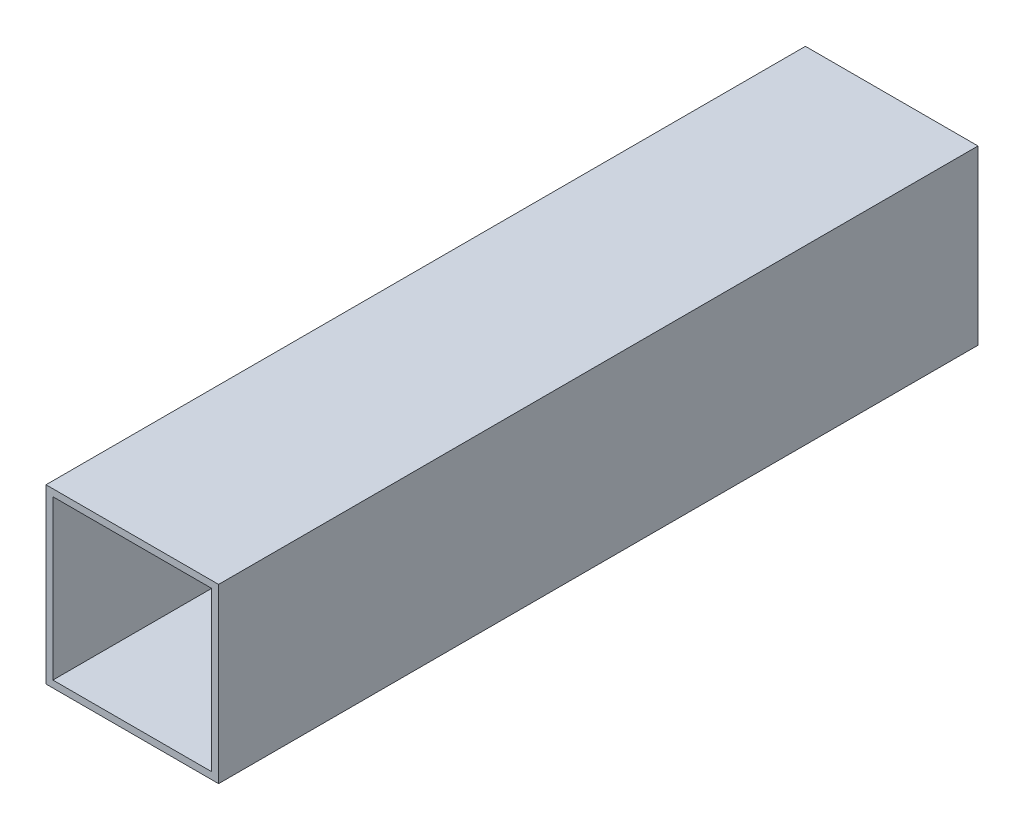
ISO-10303-21;
HEADER;
FILE_DESCRIPTION(('STEP AP214'),'2;1');
FILE_NAME('part.step','',(''),(''),'','','');
FILE_SCHEMA(('AUTOMOTIVE_DESIGN { 1 0 10303 214 1 1 1 1 }'));
ENDSEC;
DATA;
#1=APPLICATION_CONTEXT('core data for automotive mechanical design processes');
#2=APPLICATION_PROTOCOL_DEFINITION('international standard','automotive_design',2000,#1);
#3=PRODUCT_CONTEXT('',#1,'mechanical');
#4=PRODUCT('Part','Part','',(#3));
#5=PRODUCT_RELATED_PRODUCT_CATEGORY('part','',(#4));
#6=PRODUCT_DEFINITION_FORMATION('','',#4);
#7=PRODUCT_DEFINITION_CONTEXT('part definition',#1,'design');
#8=PRODUCT_DEFINITION('design','',#6,#7);
#9=PRODUCT_DEFINITION_SHAPE('','',#8);
#10=(LENGTH_UNIT() NAMED_UNIT(*) SI_UNIT(.MILLI.,.METRE.));
#11=(NAMED_UNIT(*) PLANE_ANGLE_UNIT() SI_UNIT($,.RADIAN.));
#12=(NAMED_UNIT(*) SI_UNIT($,.STERADIAN.) SOLID_ANGLE_UNIT());
#13=UNCERTAINTY_MEASURE_WITH_UNIT(LENGTH_MEASURE(1.E-05),#10,'distance_accuracy_value','');
#14=(GEOMETRIC_REPRESENTATION_CONTEXT(3) GLOBAL_UNCERTAINTY_ASSIGNED_CONTEXT((#13)) GLOBAL_UNIT_ASSIGNED_CONTEXT((#10,
#11,#12)) REPRESENTATION_CONTEXT('',''));
#15=CARTESIAN_POINT('',(0.,0.,0.));
#16=DIRECTION('',(0.,0.,1.));
#17=DIRECTION('',(1.,0.,0.));
#18=AXIS2_PLACEMENT_3D('',#15,#16,#17);
#19=CARTESIAN_POINT('',(0.,0.,220.));
#20=DIRECTION('',(0.,0.,-1.));
#21=DIRECTION('',(-1.,0.,0.));
#22=AXIS2_PLACEMENT_3D('',#19,#20,#21);
#23=PLANE('',#22);
#24=DIRECTION('',(0.,1.,0.));
#25=VECTOR('',#24,1.);
#26=CARTESIAN_POINT('',(25.,-25.,220.));
#27=LINE('',#26,#25);
#28=CARTESIAN_POINT('',(25.,-25.,220.));
#29=VERTEX_POINT('',#28);
#30=CARTESIAN_POINT('',(25.,25.,220.));
#31=VERTEX_POINT('',#30);
#32=EDGE_CURVE('E153',#29,#31,#27,.T.);
#33=ORIENTED_EDGE('',*,*,#32,.T.);
#34=DIRECTION('',(-1.,0.,0.));
#35=VECTOR('',#34,1.);
#36=CARTESIAN_POINT('',(-25.,25.,220.));
#37=LINE('',#36,#35);
#38=CARTESIAN_POINT('',(-25.,25.,220.));
#39=VERTEX_POINT('',#38);
#40=EDGE_CURVE('E157',#31,#39,#37,.T.);
#41=ORIENTED_EDGE('',*,*,#40,.T.);
#42=DIRECTION('',(0.,-1.,0.));
#43=VECTOR('',#42,1.);
#44=CARTESIAN_POINT('',(-25.,-25.,220.));
#45=LINE('',#44,#43);
#46=CARTESIAN_POINT('',(-25.,-25.,220.));
#47=VERTEX_POINT('',#46);
#48=EDGE_CURVE('E161',#39,#47,#45,.T.);
#49=ORIENTED_EDGE('',*,*,#48,.T.);
#50=DIRECTION('',(1.,0.,0.));
#51=VECTOR('',#50,1.);
#52=CARTESIAN_POINT('',(-25.,-25.,220.));
#53=LINE('',#52,#51);
#54=EDGE_CURVE('E164',#47,#29,#53,.T.);
#55=ORIENTED_EDGE('',*,*,#54,.T.);
#56=EDGE_LOOP('',(#33,#41,#49,#55));
#57=FACE_BOUND('',#56,.T.);
#58=DIRECTION('',(0.,1.,0.));
#59=VECTOR('',#58,1.);
#60=CARTESIAN_POINT('',(23.,-23.,220.));
#61=LINE('',#60,#59);
#62=CARTESIAN_POINT('',(23.,-23.,220.));
#63=VERTEX_POINT('',#62);
#64=CARTESIAN_POINT('',(23.,23.,220.));
#65=VERTEX_POINT('',#64);
#66=EDGE_CURVE('E105',#63,#65,#61,.T.);
#67=ORIENTED_EDGE('',*,*,#66,.F.);
#68=DIRECTION('',(1.,0.,0.));
#69=VECTOR('',#68,1.);
#70=CARTESIAN_POINT('',(-23.,-23.,220.));
#71=LINE('',#70,#69);
#72=CARTESIAN_POINT('',(-23.,-23.,220.));
#73=VERTEX_POINT('',#72);
#74=EDGE_CURVE('E131',#73,#63,#71,.T.);
#75=ORIENTED_EDGE('',*,*,#74,.F.);
#76=DIRECTION('',(0.,-1.,0.));
#77=VECTOR('',#76,1.);
#78=CARTESIAN_POINT('',(-23.,-23.,220.));
#79=LINE('',#78,#77);
#80=CARTESIAN_POINT('',(-23.,23.,220.));
#81=VERTEX_POINT('',#80);
#82=EDGE_CURVE('E127',#81,#73,#79,.T.);
#83=ORIENTED_EDGE('',*,*,#82,.F.);
#84=DIRECTION('',(-1.,0.,0.));
#85=VECTOR('',#84,1.);
#86=CARTESIAN_POINT('',(-23.,23.,220.));
#87=LINE('',#86,#85);
#88=EDGE_CURVE('E114',#65,#81,#87,.T.);
#89=ORIENTED_EDGE('',*,*,#88,.F.);
#90=EDGE_LOOP('',(#67,#75,#83,#89));
#91=FACE_BOUND('',#90,.T.);
#92=ADVANCED_FACE('F39',(#57,#91),#23,.F.);
#93=CARTESIAN_POINT('',(0.,0.,0.));
#94=DIRECTION('',(0.,0.,-1.));
#95=DIRECTION('',(-1.,0.,0.));
#96=AXIS2_PLACEMENT_3D('',#93,#94,#95);
#97=PLANE('',#96);
#98=DIRECTION('',(0.,1.,0.));
#99=VECTOR('',#98,1.);
#100=CARTESIAN_POINT('',(25.,-25.,0.));
#101=LINE('',#100,#99);
#102=CARTESIAN_POINT('',(25.,-25.,0.));
#103=VERTEX_POINT('',#102);
#104=CARTESIAN_POINT('',(25.,25.,0.));
#105=VERTEX_POINT('',#104);
#106=EDGE_CURVE('E123',#103,#105,#101,.T.);
#107=ORIENTED_EDGE('',*,*,#106,.F.);
#108=DIRECTION('',(1.,0.,0.));
#109=VECTOR('',#108,1.);
#110=CARTESIAN_POINT('',(-25.,-25.,0.));
#111=LINE('',#110,#109);
#112=CARTESIAN_POINT('',(-25.,-25.,0.));
#113=VERTEX_POINT('',#112);
#114=EDGE_CURVE('E158',#113,#103,#111,.T.);
#115=ORIENTED_EDGE('',*,*,#114,.F.);
#116=DIRECTION('',(0.,-1.,0.));
#117=VECTOR('',#116,1.);
#118=CARTESIAN_POINT('',(-25.,-25.,0.));
#119=LINE('',#118,#117);
#120=CARTESIAN_POINT('',(-25.,25.,0.));
#121=VERTEX_POINT('',#120);
#122=EDGE_CURVE('E174',#121,#113,#119,.T.);
#123=ORIENTED_EDGE('',*,*,#122,.F.);
#124=DIRECTION('',(-1.,0.,0.));
#125=VECTOR('',#124,1.);
#126=CARTESIAN_POINT('',(-25.,25.,0.));
#127=LINE('',#126,#125);
#128=EDGE_CURVE('E171',#105,#121,#127,.T.);
#129=ORIENTED_EDGE('',*,*,#128,.F.);
#130=EDGE_LOOP('',(#107,#115,#123,#129));
#131=FACE_BOUND('',#130,.T.);
#132=DIRECTION('',(1.,0.,0.));
#133=VECTOR('',#132,1.);
#134=CARTESIAN_POINT('',(-23.,-23.,0.));
#135=LINE('',#134,#133);
#136=CARTESIAN_POINT('',(-23.,-23.,0.));
#137=VERTEX_POINT('',#136);
#138=CARTESIAN_POINT('',(23.,-23.,0.));
#139=VERTEX_POINT('',#138);
#140=EDGE_CURVE('E115',#137,#139,#135,.T.);
#141=ORIENTED_EDGE('',*,*,#140,.T.);
#142=DIRECTION('',(0.,1.,0.));
#143=VECTOR('',#142,1.);
#144=CARTESIAN_POINT('',(23.,-23.,0.));
#145=LINE('',#144,#143);
#146=CARTESIAN_POINT('',(23.,23.,0.));
#147=VERTEX_POINT('',#146);
#148=EDGE_CURVE('E63',#139,#147,#145,.T.);
#149=ORIENTED_EDGE('',*,*,#148,.T.);
#150=DIRECTION('',(-1.,0.,0.));
#151=VECTOR('',#150,1.);
#152=CARTESIAN_POINT('',(-23.,23.,0.));
#153=LINE('',#152,#151);
#154=CARTESIAN_POINT('',(-23.,23.,0.));
#155=VERTEX_POINT('',#154);
#156=EDGE_CURVE('E121',#147,#155,#153,.T.);
#157=ORIENTED_EDGE('',*,*,#156,.T.);
#158=DIRECTION('',(0.,-1.,0.));
#159=VECTOR('',#158,1.);
#160=CARTESIAN_POINT('',(-23.,-23.,0.));
#161=LINE('',#160,#159);
#162=EDGE_CURVE('E140',#155,#137,#161,.T.);
#163=ORIENTED_EDGE('',*,*,#162,.T.);
#164=EDGE_LOOP('',(#141,#149,#157,#163));
#165=FACE_BOUND('',#164,.T.);
#166=ADVANCED_FACE('F197',(#131,#165),#97,.T.);
#167=CARTESIAN_POINT('',(25.,-25.,220.));
#168=DIRECTION('',(-1.,0.,0.));
#169=DIRECTION('',(0.,0.,1.));
#170=AXIS2_PLACEMENT_3D('',#167,#168,#169);
#171=PLANE('',#170);
#172=ORIENTED_EDGE('',*,*,#106,.T.);
#173=DIRECTION('',(0.,0.,-1.));
#174=VECTOR('',#173,1.);
#175=CARTESIAN_POINT('',(25.,25.,220.));
#176=LINE('',#175,#174);
#177=EDGE_CURVE('E11',#31,#105,#176,.T.);
#178=ORIENTED_EDGE('',*,*,#177,.F.);
#179=ORIENTED_EDGE('',*,*,#32,.F.);
#180=DIRECTION('',(0.,0.,-1.));
#181=VECTOR('',#180,1.);
#182=CARTESIAN_POINT('',(25.,-25.,220.));
#183=LINE('',#182,#181);
#184=EDGE_CURVE('E167',#29,#103,#183,.T.);
#185=ORIENTED_EDGE('',*,*,#184,.T.);
#186=EDGE_LOOP('',(#172,#178,#179,#185));
#187=FACE_BOUND('',#186,.T.);
#188=ADVANCED_FACE('F41',(#187),#171,.F.);
#189=CARTESIAN_POINT('',(-25.,25.,220.));
#190=DIRECTION('',(0.,-1.,0.));
#191=DIRECTION('',(1.,0.,0.));
#192=AXIS2_PLACEMENT_3D('',#189,#190,#191);
#193=PLANE('',#192);
#194=ORIENTED_EDGE('',*,*,#128,.T.);
#195=DIRECTION('',(0.,0.,-1.));
#196=VECTOR('',#195,1.);
#197=CARTESIAN_POINT('',(-25.,25.,220.));
#198=LINE('',#197,#196);
#199=EDGE_CURVE('E48',#39,#121,#198,.T.);
#200=ORIENTED_EDGE('',*,*,#199,.F.);
#201=ORIENTED_EDGE('',*,*,#40,.F.);
#202=ORIENTED_EDGE('',*,*,#177,.T.);
#203=EDGE_LOOP('',(#194,#200,#201,#202));
#204=FACE_BOUND('',#203,.T.);
#205=ADVANCED_FACE('F207',(#204),#193,.F.);
#206=CARTESIAN_POINT('',(-25.,-25.,220.));
#207=DIRECTION('',(1.,0.,0.));
#208=DIRECTION('',(0.,0.,-1.));
#209=AXIS2_PLACEMENT_3D('',#206,#207,#208);
#210=PLANE('',#209);
#211=ORIENTED_EDGE('',*,*,#122,.T.);
#212=DIRECTION('',(0.,0.,-1.));
#213=VECTOR('',#212,1.);
#214=CARTESIAN_POINT('',(-25.,-25.,220.));
#215=LINE('',#214,#213);
#216=EDGE_CURVE('E182',#47,#113,#215,.T.);
#217=ORIENTED_EDGE('',*,*,#216,.F.);
#218=ORIENTED_EDGE('',*,*,#48,.F.);
#219=ORIENTED_EDGE('',*,*,#199,.T.);
#220=EDGE_LOOP('',(#211,#217,#218,#219));
#221=FACE_BOUND('',#220,.T.);
#222=ADVANCED_FACE('F191',(#221),#210,.F.);
#223=CARTESIAN_POINT('',(-25.,-25.,220.));
#224=DIRECTION('',(0.,1.,0.));
#225=DIRECTION('',(0.,0.,1.));
#226=AXIS2_PLACEMENT_3D('',#223,#224,#225);
#227=PLANE('',#226);
#228=ORIENTED_EDGE('',*,*,#114,.T.);
#229=ORIENTED_EDGE('',*,*,#184,.F.);
#230=ORIENTED_EDGE('',*,*,#54,.F.);
#231=ORIENTED_EDGE('',*,*,#216,.T.);
#232=EDGE_LOOP('',(#228,#229,#230,#231));
#233=FACE_BOUND('',#232,.T.);
#234=ADVANCED_FACE('F201',(#233),#227,.F.);
#235=CARTESIAN_POINT('',(23.,-23.,220.));
#236=DIRECTION('',(-1.,0.,0.));
#237=DIRECTION('',(0.,0.,1.));
#238=AXIS2_PLACEMENT_3D('',#235,#236,#237);
#239=PLANE('',#238);
#240=ORIENTED_EDGE('',*,*,#148,.F.);
#241=DIRECTION('',(0.,0.,-1.));
#242=VECTOR('',#241,1.);
#243=CARTESIAN_POINT('',(23.,-23.,220.));
#244=LINE('',#243,#242);
#245=EDGE_CURVE('E109',#63,#139,#244,.T.);
#246=ORIENTED_EDGE('',*,*,#245,.F.);
#247=ORIENTED_EDGE('',*,*,#66,.T.);
#248=DIRECTION('',(0.,0.,-1.));
#249=VECTOR('',#248,1.);
#250=CARTESIAN_POINT('',(23.,23.,220.));
#251=LINE('',#250,#249);
#252=EDGE_CURVE('E108',#65,#147,#251,.T.);
#253=ORIENTED_EDGE('',*,*,#252,.T.);
#254=EDGE_LOOP('',(#240,#246,#247,#253));
#255=FACE_BOUND('',#254,.T.);
#256=ADVANCED_FACE('F107',(#255),#239,.T.);
#257=CARTESIAN_POINT('',(-23.,23.,220.));
#258=DIRECTION('',(0.,-1.,0.));
#259=DIRECTION('',(0.,0.,-1.));
#260=AXIS2_PLACEMENT_3D('',#257,#258,#259);
#261=PLANE('',#260);
#262=ORIENTED_EDGE('',*,*,#156,.F.);
#263=ORIENTED_EDGE('',*,*,#252,.F.);
#264=ORIENTED_EDGE('',*,*,#88,.T.);
#265=DIRECTION('',(0.,0.,-1.));
#266=VECTOR('',#265,1.);
#267=CARTESIAN_POINT('',(-23.,23.,220.));
#268=LINE('',#267,#266);
#269=EDGE_CURVE('E124',#81,#155,#268,.T.);
#270=ORIENTED_EDGE('',*,*,#269,.T.);
#271=EDGE_LOOP('',(#262,#263,#264,#270));
#272=FACE_BOUND('',#271,.T.);
#273=ADVANCED_FACE('F118',(#272),#261,.T.);
#274=CARTESIAN_POINT('',(-23.,-23.,220.));
#275=DIRECTION('',(1.,0.,0.));
#276=DIRECTION('',(0.,0.,-1.));
#277=AXIS2_PLACEMENT_3D('',#274,#275,#276);
#278=PLANE('',#277);
#279=ORIENTED_EDGE('',*,*,#162,.F.);
#280=ORIENTED_EDGE('',*,*,#269,.F.);
#281=ORIENTED_EDGE('',*,*,#82,.T.);
#282=DIRECTION('',(0.,0.,-1.));
#283=VECTOR('',#282,1.);
#284=CARTESIAN_POINT('',(-23.,-23.,220.));
#285=LINE('',#284,#283);
#286=EDGE_CURVE('E55',#73,#137,#285,.T.);
#287=ORIENTED_EDGE('',*,*,#286,.T.);
#288=EDGE_LOOP('',(#279,#280,#281,#287));
#289=FACE_BOUND('',#288,.T.);
#290=ADVANCED_FACE('F230',(#289),#278,.T.);
#291=CARTESIAN_POINT('',(-23.,-23.,220.));
#292=DIRECTION('',(0.,1.,0.));
#293=DIRECTION('',(0.,0.,1.));
#294=AXIS2_PLACEMENT_3D('',#291,#292,#293);
#295=PLANE('',#294);
#296=ORIENTED_EDGE('',*,*,#140,.F.);
#297=ORIENTED_EDGE('',*,*,#286,.F.);
#298=ORIENTED_EDGE('',*,*,#74,.T.);
#299=ORIENTED_EDGE('',*,*,#245,.T.);
#300=EDGE_LOOP('',(#296,#297,#298,#299));
#301=FACE_BOUND('',#300,.T.);
#302=ADVANCED_FACE('F234',(#301),#295,.T.);
#303=CLOSED_SHELL('',(#92,#166,#188,#205,#222,#234,#256,#273,#290,#302));
#304=MANIFOLD_SOLID_BREP('B2',#303);
#305=ADVANCED_BREP_SHAPE_REPRESENTATION('',(#18,#304),#14);
#306=SHAPE_DEFINITION_REPRESENTATION(#9,#305);
ENDSEC;
END-ISO-10303-21;
